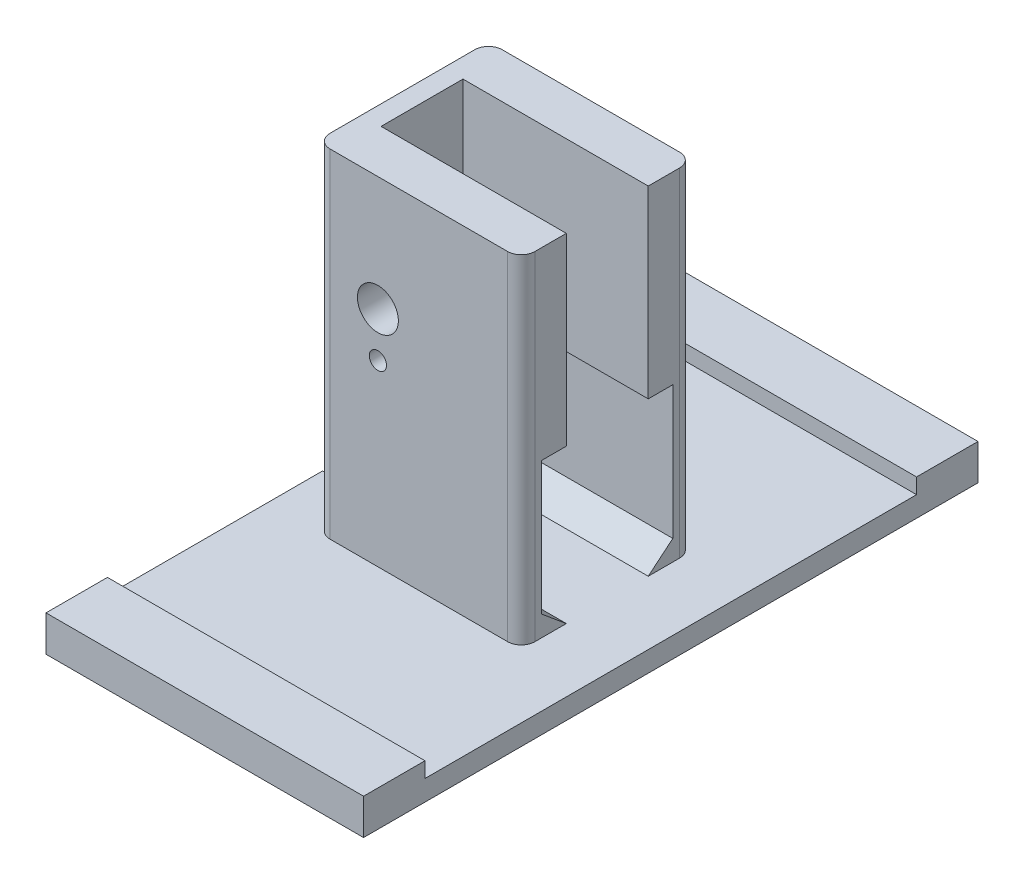
ISO-10303-21;
HEADER;
FILE_DESCRIPTION(('STEP AP214'),'2;1');
FILE_NAME('part.step','',(''),(''),'','','');
FILE_SCHEMA(('AUTOMOTIVE_DESIGN { 1 0 10303 214 1 1 1 1 }'));
ENDSEC;
DATA;
#1=APPLICATION_CONTEXT('core data for automotive mechanical design processes');
#2=APPLICATION_PROTOCOL_DEFINITION('international standard','automotive_design',2000,#1);
#3=PRODUCT_CONTEXT('',#1,'mechanical');
#4=PRODUCT('Part','Part','',(#3));
#5=PRODUCT_RELATED_PRODUCT_CATEGORY('part','',(#4));
#6=PRODUCT_DEFINITION_FORMATION('','',#4);
#7=PRODUCT_DEFINITION_CONTEXT('part definition',#1,'design');
#8=PRODUCT_DEFINITION('design','',#6,#7);
#9=PRODUCT_DEFINITION_SHAPE('','',#8);
#10=(LENGTH_UNIT() NAMED_UNIT(*) SI_UNIT(.MILLI.,.METRE.));
#11=(NAMED_UNIT(*) PLANE_ANGLE_UNIT() SI_UNIT($,.RADIAN.));
#12=(NAMED_UNIT(*) SI_UNIT($,.STERADIAN.) SOLID_ANGLE_UNIT());
#13=UNCERTAINTY_MEASURE_WITH_UNIT(LENGTH_MEASURE(1.E-05),#10,'distance_accuracy_value','');
#14=(GEOMETRIC_REPRESENTATION_CONTEXT(3) GLOBAL_UNCERTAINTY_ASSIGNED_CONTEXT((#13)) GLOBAL_UNIT_ASSIGNED_CONTEXT((#10,
#11,#12)) REPRESENTATION_CONTEXT('',''));
#15=CARTESIAN_POINT('',(0.,0.,0.));
#16=DIRECTION('',(0.,0.,1.));
#17=DIRECTION('',(1.,0.,0.));
#18=AXIS2_PLACEMENT_3D('',#15,#16,#17);
#19=CARTESIAN_POINT('',(0.,44.45,-43.18));
#20=DIRECTION('',(0.,0.,-1.));
#21=DIRECTION('',(-1.,0.,0.));
#22=AXIS2_PLACEMENT_3D('',#19,#20,#21);
#23=PLANE('',#22);
#24=CARTESIAN_POINT('',(13.7278569507453,24.6888,-43.18));
#25=DIRECTION('',(0.,0.,-1.));
#26=DIRECTION('',(-1.,0.,0.));
#27=AXIS2_PLACEMENT_3D('',#24,#25,#26);
#28=CIRCLE('',#27,1.0668);
#29=CARTESIAN_POINT('',(12.6610569507453,24.6888,-43.18));
#30=VERTEX_POINT('',#29);
#31=EDGE_CURVE('E324',#30,#30,#28,.T.);
#32=ORIENTED_EDGE('',*,*,#31,.T.);
#33=EDGE_LOOP('',(#32));
#34=FACE_BOUND('',#33,.T.);
#35=CARTESIAN_POINT('',(13.7278569507453,30.226,-43.18));
#36=DIRECTION('',(0.,0.,-1.));
#37=DIRECTION('',(-1.,0.,0.));
#38=AXIS2_PLACEMENT_3D('',#35,#36,#37);
#39=CIRCLE('',#38,2.54);
#40=CARTESIAN_POINT('',(11.1878569507453,30.226,-43.18));
#41=VERTEX_POINT('',#40);
#42=EDGE_CURVE('E336',#41,#41,#39,.T.);
#43=ORIENTED_EDGE('',*,*,#42,.T.);
#44=EDGE_LOOP('',(#43));
#45=FACE_BOUND('',#44,.T.);
#46=DIRECTION('',(1.,0.,0.));
#47=VECTOR('',#46,1.);
#48=CARTESIAN_POINT('',(31.5078569507453,21.59,-43.18));
#49=LINE('',#48,#47);
#50=CARTESIAN_POINT('',(8.53341445597468,21.59,-43.18));
#51=VERTEX_POINT('',#50);
#52=CARTESIAN_POINT('',(31.5078569507453,21.59,-43.18));
#53=VERTEX_POINT('',#52);
#54=EDGE_CURVE('E882',#51,#53,#49,.T.);
#55=ORIENTED_EDGE('',*,*,#54,.T.);
#56=DIRECTION('',(0.,-1.,0.));
#57=VECTOR('',#56,1.);
#58=CARTESIAN_POINT('',(31.5078569507453,44.45,-43.18));
#59=LINE('',#58,#57);
#60=CARTESIAN_POINT('',(31.5078569507453,44.45,-43.18));
#61=VERTEX_POINT('',#60);
#62=EDGE_CURVE('E364',#61,#53,#59,.T.);
#63=ORIENTED_EDGE('',*,*,#62,.F.);
#64=DIRECTION('',(1.,0.,0.));
#65=VECTOR('',#64,1.);
#66=CARTESIAN_POINT('',(0.,44.45,-43.18));
#67=LINE('',#66,#65);
#68=CARTESIAN_POINT('',(8.53341445597468,44.45,-43.18));
#69=VERTEX_POINT('',#68);
#70=EDGE_CURVE('E348',#69,#61,#67,.T.);
#71=ORIENTED_EDGE('',*,*,#70,.F.);
#72=DIRECTION('',(0.,-1.,0.));
#73=VECTOR('',#72,1.);
#74=CARTESIAN_POINT('',(8.53341445597468,44.45,-43.18));
#75=LINE('',#74,#73);
#76=EDGE_CURVE('E367',#69,#51,#75,.T.);
#77=ORIENTED_EDGE('',*,*,#76,.T.);
#78=EDGE_LOOP('',(#55,#63,#71,#77));
#79=FACE_BOUND('',#78,.T.);
#80=ADVANCED_FACE('F35',(#34,#45,#79),#23,.F.);
#81=CARTESIAN_POINT('',(31.5078569507453,44.45,0.));
#82=DIRECTION('',(1.,0.,0.));
#83=DIRECTION('',(0.,0.,-1.));
#84=AXIS2_PLACEMENT_3D('',#81,#82,#83);
#85=PLANE('',#84);
#86=DIRECTION('',(0.,0.64018439966448,-0.768221279597376));
#87=VECTOR('',#86,1.);
#88=CARTESIAN_POINT('',(31.5078569507453,2.54,-43.18));
#89=LINE('',#88,#87);
#90=CARTESIAN_POINT('',(31.5078569507453,2.54,-43.18));
#91=VERTEX_POINT('',#90);
#92=CARTESIAN_POINT('',(31.5078569507453,5.08,-46.228));
#93=VERTEX_POINT('',#92);
#94=EDGE_CURVE('E226',#91,#93,#89,.T.);
#95=ORIENTED_EDGE('',*,*,#94,.F.);
#96=DIRECTION('',(0.,0.,-1.));
#97=VECTOR('',#96,1.);
#98=CARTESIAN_POINT('',(31.5078569507453,2.54,0.));
#99=LINE('',#98,#97);
#100=CARTESIAN_POINT('',(31.5078569507453,2.54,-47.0746666666667));
#101=VERTEX_POINT('',#100);
#102=EDGE_CURVE('E231',#91,#101,#99,.T.);
#103=ORIENTED_EDGE('',*,*,#102,.T.);
#104=DIRECTION('',(0.,1.,0.));
#105=VECTOR('',#104,1.);
#106=CARTESIAN_POINT('',(31.5078569507453,0.145265034381545,-47.0746666666667));
#107=LINE('',#106,#105);
#108=CARTESIAN_POINT('',(31.5078569507453,44.45,-47.0746666666667));
#109=VERTEX_POINT('',#108);
#110=EDGE_CURVE('E306',#101,#109,#107,.T.);
#111=ORIENTED_EDGE('',*,*,#110,.T.);
#112=DIRECTION('',(0.,0.,1.));
#113=VECTOR('',#112,1.);
#114=CARTESIAN_POINT('',(31.5078569507453,44.45,0.));
#115=LINE('',#114,#113);
#116=EDGE_CURVE('E351',#109,#61,#115,.T.);
#117=ORIENTED_EDGE('',*,*,#116,.T.);
#118=ORIENTED_EDGE('',*,*,#62,.T.);
#119=DIRECTION('',(0.,0.,-1.));
#120=VECTOR('',#119,1.);
#121=CARTESIAN_POINT('',(31.5078569507453,21.59,-46.228));
#122=LINE('',#121,#120);
#123=CARTESIAN_POINT('',(31.5078569507453,21.59,-46.228));
#124=VERTEX_POINT('',#123);
#125=EDGE_CURVE('E885',#53,#124,#122,.T.);
#126=ORIENTED_EDGE('',*,*,#125,.T.);
#127=DIRECTION('',(0.,-1.,0.));
#128=VECTOR('',#127,1.);
#129=CARTESIAN_POINT('',(31.5078569507453,21.59,-46.228));
#130=LINE('',#129,#128);
#131=EDGE_CURVE('E240',#124,#93,#130,.T.);
#132=ORIENTED_EDGE('',*,*,#131,.T.);
#133=EDGE_LOOP('',(#95,#103,#111,#117,#118,#126,#132));
#134=FACE_BOUND('',#133,.T.);
#135=ADVANCED_FACE('F236',(#134),#85,.T.);
#136=CARTESIAN_POINT('',(0.,44.45,-27.432));
#137=DIRECTION('',(0.,0.,-1.));
#138=DIRECTION('',(-1.,0.,0.));
#139=AXIS2_PLACEMENT_3D('',#136,#137,#138);
#140=PLANE('',#139);
#141=CARTESIAN_POINT('',(13.7278569507453,30.226,-27.432));
#142=DIRECTION('',(0.,0.,-1.));
#143=DIRECTION('',(-1.,0.,0.));
#144=AXIS2_PLACEMENT_3D('',#141,#142,#143);
#145=CIRCLE('',#144,2.54);
#146=CARTESIAN_POINT('',(11.1878569507453,30.226,-27.432));
#147=VERTEX_POINT('',#146);
#148=EDGE_CURVE('E333',#147,#147,#145,.F.);
#149=ORIENTED_EDGE('',*,*,#148,.F.);
#150=EDGE_LOOP('',(#149));
#151=FACE_BOUND('',#150,.T.);
#152=CARTESIAN_POINT('',(13.7278569507453,24.6888,-27.432));
#153=DIRECTION('',(0.,0.,-1.));
#154=DIRECTION('',(-1.,0.,0.));
#155=AXIS2_PLACEMENT_3D('',#152,#153,#154);
#156=CIRCLE('',#155,1.0668);
#157=CARTESIAN_POINT('',(12.6610569507453,24.6888,-27.432));
#158=VERTEX_POINT('',#157);
#159=EDGE_CURVE('E321',#158,#158,#156,.F.);
#160=ORIENTED_EDGE('',*,*,#159,.F.);
#161=EDGE_LOOP('',(#160));
#162=FACE_BOUND('',#161,.T.);
#163=DIRECTION('',(0.,1.,0.));
#164=VECTOR('',#163,1.);
#165=CARTESIAN_POINT('',(29.8145236174119,0.145265034381545,-27.432));
#166=LINE('',#165,#164);
#167=CARTESIAN_POINT('',(29.8145236174119,2.54,-27.432));
#168=VERTEX_POINT('',#167);
#169=CARTESIAN_POINT('',(29.8145236174119,44.45,-27.432));
#170=VERTEX_POINT('',#169);
#171=EDGE_CURVE('E873',#168,#170,#166,.T.);
#172=ORIENTED_EDGE('',*,*,#171,.T.);
#173=DIRECTION('',(1.,0.,0.));
#174=VECTOR('',#173,1.);
#175=CARTESIAN_POINT('',(0.,44.45,-27.432));
#176=LINE('',#175,#174);
#177=CARTESIAN_POINT('',(7.80119028407861,44.45,-27.432));
#178=VERTEX_POINT('',#177);
#179=EDGE_CURVE('E358',#178,#170,#176,.T.);
#180=ORIENTED_EDGE('',*,*,#179,.F.);
#181=DIRECTION('',(0.,1.,0.));
#182=VECTOR('',#181,1.);
#183=CARTESIAN_POINT('',(7.80119028407861,0.145265034381545,-27.432));
#184=LINE('',#183,#182);
#185=CARTESIAN_POINT('',(7.80119028407861,2.54,-27.432));
#186=VERTEX_POINT('',#185);
#187=EDGE_CURVE('E302',#186,#178,#184,.T.);
#188=ORIENTED_EDGE('',*,*,#187,.F.);
#189=DIRECTION('',(-1.,0.,0.));
#190=VECTOR('',#189,1.);
#191=CARTESIAN_POINT('',(0.,2.54,-27.432));
#192=LINE('',#191,#190);
#193=EDGE_CURVE('E273',#168,#186,#192,.T.);
#194=ORIENTED_EDGE('',*,*,#193,.F.);
#195=EDGE_LOOP('',(#172,#180,#188,#194));
#196=FACE_BOUND('',#195,.T.);
#197=ADVANCED_FACE('F501',(#151,#162,#196),#140,.F.);
#198=DIRECTION('',(0.,-0.64018439966448,-0.768221279597376));
#199=VECTOR('',#198,1.);
#200=CARTESIAN_POINT('',(31.5078569507453,2.54,-33.02));
#201=LINE('',#200,#199);
#202=CARTESIAN_POINT('',(31.5078569507453,5.08,-29.972));
#203=VERTEX_POINT('',#202);
#204=CARTESIAN_POINT('',(31.5078569507453,2.54,-33.02));
#205=VERTEX_POINT('',#204);
#206=EDGE_CURVE('E262',#203,#205,#201,.T.);
#207=ORIENTED_EDGE('',*,*,#206,.F.);
#208=DIRECTION('',(0.,-1.,0.));
#209=VECTOR('',#208,1.);
#210=CARTESIAN_POINT('',(31.5078569507453,21.59,-29.972));
#211=LINE('',#210,#209);
#212=CARTESIAN_POINT('',(31.5078569507453,21.59,-29.972));
#213=VERTEX_POINT('',#212);
#214=EDGE_CURVE('E893',#213,#203,#211,.T.);
#215=ORIENTED_EDGE('',*,*,#214,.F.);
#216=DIRECTION('',(0.,0.,-1.));
#217=VECTOR('',#216,1.);
#218=CARTESIAN_POINT('',(31.5078569507453,21.59,-29.972));
#219=LINE('',#218,#217);
#220=CARTESIAN_POINT('',(31.5078569507453,21.59,-33.02));
#221=VERTEX_POINT('',#220);
#222=EDGE_CURVE('E853',#213,#221,#219,.T.);
#223=ORIENTED_EDGE('',*,*,#222,.T.);
#224=DIRECTION('',(0.,-1.,0.));
#225=VECTOR('',#224,1.);
#226=CARTESIAN_POINT('',(31.5078569507453,44.45,-33.02));
#227=LINE('',#226,#225);
#228=CARTESIAN_POINT('',(31.5078569507453,44.45,-33.02));
#229=VERTEX_POINT('',#228);
#230=EDGE_CURVE('E361',#229,#221,#227,.T.);
#231=ORIENTED_EDGE('',*,*,#230,.F.);
#232=CARTESIAN_POINT('',(31.5078569507453,44.45,-29.1253333333333));
#233=VERTEX_POINT('',#232);
#234=EDGE_CURVE('E354',#229,#233,#115,.T.);
#235=ORIENTED_EDGE('',*,*,#234,.T.);
#236=DIRECTION('',(0.,1.,0.));
#237=VECTOR('',#236,1.);
#238=CARTESIAN_POINT('',(31.5078569507453,0.145265034381545,-29.1253333333333));
#239=LINE('',#238,#237);
#240=CARTESIAN_POINT('',(31.5078569507453,2.54,-29.1253333333333));
#241=VERTEX_POINT('',#240);
#242=EDGE_CURVE('E272',#241,#233,#239,.T.);
#243=ORIENTED_EDGE('',*,*,#242,.F.);
#244=DIRECTION('',(0.,0.,-1.));
#245=VECTOR('',#244,1.);
#246=CARTESIAN_POINT('',(31.5078569507453,2.54,0.));
#247=LINE('',#246,#245);
#248=EDGE_CURVE('E258',#241,#205,#247,.T.);
#249=ORIENTED_EDGE('',*,*,#248,.T.);
#250=EDGE_LOOP('',(#207,#215,#223,#231,#235,#243,#249));
#251=FACE_BOUND('',#250,.T.);
#252=ADVANCED_FACE('F270',(#251),#85,.T.);
#253=CARTESIAN_POINT('',(0.,44.45,-48.768));
#254=DIRECTION('',(0.,0.,-1.));
#255=DIRECTION('',(-1.,0.,0.));
#256=AXIS2_PLACEMENT_3D('',#253,#254,#255);
#257=PLANE('',#256);
#258=CARTESIAN_POINT('',(13.7278569507453,24.6888,-48.768));
#259=DIRECTION('',(0.,0.,-1.));
#260=DIRECTION('',(-1.,0.,0.));
#261=AXIS2_PLACEMENT_3D('',#258,#259,#260);
#262=CIRCLE('',#261,1.0668);
#263=CARTESIAN_POINT('',(12.6610569507453,24.6888,-48.768));
#264=VERTEX_POINT('',#263);
#265=EDGE_CURVE('E312',#264,#264,#262,.T.);
#266=ORIENTED_EDGE('',*,*,#265,.F.);
#267=EDGE_LOOP('',(#266));
#268=FACE_BOUND('',#267,.T.);
#269=CARTESIAN_POINT('',(13.7278569507453,30.226,-48.768));
#270=DIRECTION('',(0.,0.,-1.));
#271=DIRECTION('',(-1.,0.,0.));
#272=AXIS2_PLACEMENT_3D('',#269,#270,#271);
#273=CIRCLE('',#272,2.54);
#274=CARTESIAN_POINT('',(11.1878569507453,30.226,-48.768));
#275=VERTEX_POINT('',#274);
#276=EDGE_CURVE('E330',#275,#275,#273,.T.);
#277=ORIENTED_EDGE('',*,*,#276,.F.);
#278=EDGE_LOOP('',(#277));
#279=FACE_BOUND('',#278,.T.);
#280=DIRECTION('',(1.,0.,0.));
#281=VECTOR('',#280,1.);
#282=CARTESIAN_POINT('',(0.,44.45,-48.768));
#283=LINE('',#282,#281);
#284=CARTESIAN_POINT('',(7.80119028407861,44.45,-48.768));
#285=VERTEX_POINT('',#284);
#286=CARTESIAN_POINT('',(29.8145236174119,44.45,-48.768));
#287=VERTEX_POINT('',#286);
#288=EDGE_CURVE('E353',#285,#287,#283,.T.);
#289=ORIENTED_EDGE('',*,*,#288,.T.);
#290=DIRECTION('',(0.,1.,0.));
#291=VECTOR('',#290,1.);
#292=CARTESIAN_POINT('',(29.8145236174119,0.145265034381545,-48.768));
#293=LINE('',#292,#291);
#294=CARTESIAN_POINT('',(29.8145236174119,2.54,-48.768));
#295=VERTEX_POINT('',#294);
#296=EDGE_CURVE('E300',#295,#287,#293,.T.);
#297=ORIENTED_EDGE('',*,*,#296,.F.);
#298=DIRECTION('',(-1.,0.,0.));
#299=VECTOR('',#298,1.);
#300=CARTESIAN_POINT('',(0.,2.54,-48.768));
#301=LINE('',#300,#299);
#302=CARTESIAN_POINT('',(7.80119028407861,2.54,-48.768));
#303=VERTEX_POINT('',#302);
#304=EDGE_CURVE('E245',#295,#303,#301,.T.);
#305=ORIENTED_EDGE('',*,*,#304,.T.);
#306=DIRECTION('',(0.,1.,0.));
#307=VECTOR('',#306,1.);
#308=CARTESIAN_POINT('',(7.80119028407861,0.145265034381545,-48.768));
#309=LINE('',#308,#307);
#310=EDGE_CURVE('E315',#303,#285,#309,.T.);
#311=ORIENTED_EDGE('',*,*,#310,.T.);
#312=EDGE_LOOP('',(#289,#297,#305,#311));
#313=FACE_BOUND('',#312,.T.);
#314=ADVANCED_FACE('F506',(#268,#279,#313),#257,.T.);
#315=CARTESIAN_POINT('',(0.,44.45,0.));
#316=DIRECTION('',(0.,1.,0.));
#317=DIRECTION('',(0.,0.,1.));
#318=AXIS2_PLACEMENT_3D('',#315,#316,#317);
#319=PLANE('',#318);
#320=CARTESIAN_POINT('',(29.8145236174119,44.45,-29.1253333333333));
#321=DIRECTION('',(0.,1.,0.));
#322=DIRECTION('',(0.,0.,1.));
#323=AXIS2_PLACEMENT_3D('',#320,#321,#322);
#324=CIRCLE('',#323,1.69333333333334);
#325=EDGE_CURVE('E845',#233,#170,#324,.F.);
#326=ORIENTED_EDGE('',*,*,#325,.F.);
#327=ORIENTED_EDGE('',*,*,#234,.F.);
#328=DIRECTION('',(1.,0.,0.));
#329=VECTOR('',#328,1.);
#330=CARTESIAN_POINT('',(0.,44.45,-33.02));
#331=LINE('',#330,#329);
#332=CARTESIAN_POINT('',(8.53341445597468,44.45,-33.02));
#333=VERTEX_POINT('',#332);
#334=EDGE_CURVE('E342',#333,#229,#331,.T.);
#335=ORIENTED_EDGE('',*,*,#334,.F.);
#336=DIRECTION('',(0.,0.,1.));
#337=VECTOR('',#336,1.);
#338=CARTESIAN_POINT('',(8.53341445597469,44.45,0.));
#339=LINE('',#338,#337);
#340=EDGE_CURVE('E345',#69,#333,#339,.T.);
#341=ORIENTED_EDGE('',*,*,#340,.F.);
#342=ORIENTED_EDGE('',*,*,#70,.T.);
#343=ORIENTED_EDGE('',*,*,#116,.F.);
#344=CARTESIAN_POINT('',(29.8145236174119,44.45,-47.0746666666667));
#345=DIRECTION('',(0.,1.,0.));
#346=DIRECTION('',(0.,0.,1.));
#347=AXIS2_PLACEMENT_3D('',#344,#345,#346);
#348=CIRCLE('',#347,1.69333333333334);
#349=EDGE_CURVE('E298',#287,#109,#348,.F.);
#350=ORIENTED_EDGE('',*,*,#349,.F.);
#351=ORIENTED_EDGE('',*,*,#288,.F.);
#352=CARTESIAN_POINT('',(7.80119028407861,44.45,-47.0746666666667));
#353=DIRECTION('',(0.,1.,0.));
#354=DIRECTION('',(0.,0.,1.));
#355=AXIS2_PLACEMENT_3D('',#352,#353,#354);
#356=CIRCLE('',#355,1.69333333333334);
#357=CARTESIAN_POINT('',(6.10785695074527,44.45,-47.0746666666667));
#358=VERTEX_POINT('',#357);
#359=EDGE_CURVE('E310',#285,#358,#356,.T.);
#360=ORIENTED_EDGE('',*,*,#359,.T.);
#361=DIRECTION('',(0.,0.,-1.));
#362=VECTOR('',#361,1.);
#363=CARTESIAN_POINT('',(6.10785695074527,44.45,0.));
#364=LINE('',#363,#362);
#365=CARTESIAN_POINT('',(6.10785695074527,44.45,-29.1253333333333));
#366=VERTEX_POINT('',#365);
#367=EDGE_CURVE('E58',#366,#358,#364,.T.);
#368=ORIENTED_EDGE('',*,*,#367,.F.);
#369=CARTESIAN_POINT('',(7.80119028407861,44.45,-29.1253333333333));
#370=DIRECTION('',(0.,1.,0.));
#371=DIRECTION('',(0.,0.,1.));
#372=AXIS2_PLACEMENT_3D('',#369,#370,#371);
#373=CIRCLE('',#372,1.69333333333334);
#374=EDGE_CURVE('E869',#178,#366,#373,.F.);
#375=ORIENTED_EDGE('',*,*,#374,.F.);
#376=ORIENTED_EDGE('',*,*,#179,.T.);
#377=EDGE_LOOP('',(#326,#327,#335,#341,#342,#343,#350,#351,#360,#368,#375,#376));
#378=FACE_BOUND('',#377,.T.);
#379=ADVANCED_FACE('F744',(#378),#319,.T.);
#380=CARTESIAN_POINT('',(39.3827,4.445,0.));
#381=DIRECTION('',(-1.,0.,0.));
#382=DIRECTION('',(0.,0.,1.));
#383=AXIS2_PLACEMENT_3D('',#380,#381,#382);
#384=PLANE('',#383);
#385=DIRECTION('',(0.,0.,-1.));
#386=VECTOR('',#385,1.);
#387=CARTESIAN_POINT('',(39.3827,0.,0.));
#388=LINE('',#387,#386);
#389=CARTESIAN_POINT('',(39.3827,0.,0.));
#390=VERTEX_POINT('',#389);
#391=CARTESIAN_POINT('',(39.3827,0.,-76.2));
#392=VERTEX_POINT('',#391);
#393=EDGE_CURVE('E427',#390,#392,#388,.T.);
#394=ORIENTED_EDGE('',*,*,#393,.T.);
#395=DIRECTION('',(0.,-1.,0.));
#396=VECTOR('',#395,1.);
#397=CARTESIAN_POINT('',(39.3827,4.445,-76.2));
#398=LINE('',#397,#396);
#399=CARTESIAN_POINT('',(39.3827,4.445,-76.2));
#400=VERTEX_POINT('',#399);
#401=EDGE_CURVE('E930',#400,#392,#398,.T.);
#402=ORIENTED_EDGE('',*,*,#401,.F.);
#403=DIRECTION('',(0.,0.,-1.));
#404=VECTOR('',#403,1.);
#405=CARTESIAN_POINT('',(39.3827,4.445,0.));
#406=LINE('',#405,#404);
#407=CARTESIAN_POINT('',(39.3827,4.445,-68.58));
#408=VERTEX_POINT('',#407);
#409=EDGE_CURVE('E377',#408,#400,#406,.T.);
#410=ORIENTED_EDGE('',*,*,#409,.F.);
#411=DIRECTION('',(0.,-1.,0.));
#412=VECTOR('',#411,1.);
#413=CARTESIAN_POINT('',(39.3827,4.445,-68.58));
#414=LINE('',#413,#412);
#415=CARTESIAN_POINT('',(39.3827,2.54,-68.58));
#416=VERTEX_POINT('',#415);
#417=EDGE_CURVE('E394',#408,#416,#414,.T.);
#418=ORIENTED_EDGE('',*,*,#417,.T.);
#419=DIRECTION('',(0.,0.,-1.));
#420=VECTOR('',#419,1.);
#421=CARTESIAN_POINT('',(39.3827,2.54,0.));
#422=LINE('',#421,#420);
#423=CARTESIAN_POINT('',(39.3827,2.54,-7.62));
#424=VERTEX_POINT('',#423);
#425=EDGE_CURVE('E407',#424,#416,#422,.T.);
#426=ORIENTED_EDGE('',*,*,#425,.F.);
#427=DIRECTION('',(0.,-1.,0.));
#428=VECTOR('',#427,1.);
#429=CARTESIAN_POINT('',(39.3827,4.445,-7.62));
#430=LINE('',#429,#428);
#431=CARTESIAN_POINT('',(39.3827,4.445,-7.62));
#432=VERTEX_POINT('',#431);
#433=EDGE_CURVE('E274',#432,#424,#430,.T.);
#434=ORIENTED_EDGE('',*,*,#433,.F.);
#435=DIRECTION('',(0.,0.,-1.));
#436=VECTOR('',#435,1.);
#437=CARTESIAN_POINT('',(39.3827,4.445,0.));
#438=LINE('',#437,#436);
#439=CARTESIAN_POINT('',(39.3827,4.445,0.));
#440=VERTEX_POINT('',#439);
#441=EDGE_CURVE('E428',#440,#432,#438,.T.);
#442=ORIENTED_EDGE('',*,*,#441,.F.);
#443=DIRECTION('',(0.,-1.,0.));
#444=VECTOR('',#443,1.);
#445=CARTESIAN_POINT('',(39.3827,4.445,0.));
#446=LINE('',#445,#444);
#447=EDGE_CURVE('E439',#440,#390,#446,.T.);
#448=ORIENTED_EDGE('',*,*,#447,.T.);
#449=EDGE_LOOP('',(#394,#402,#410,#418,#426,#434,#442,#448));
#450=FACE_BOUND('',#449,.T.);
#451=ADVANCED_FACE('F37',(#450),#384,.F.);
#452=CARTESIAN_POINT('',(0.,4.445,-7.62));
#453=DIRECTION('',(0.,0.,1.));
#454=DIRECTION('',(1.,0.,0.));
#455=AXIS2_PLACEMENT_3D('',#452,#453,#454);
#456=PLANE('',#455);
#457=ORIENTED_EDGE('',*,*,#433,.T.);
#458=DIRECTION('',(-1.,0.,0.));
#459=VECTOR('',#458,1.);
#460=CARTESIAN_POINT('',(0.,2.54,-7.62));
#461=LINE('',#460,#459);
#462=CARTESIAN_POINT('',(0.,2.54,-7.62));
#463=VERTEX_POINT('',#462);
#464=EDGE_CURVE('E406',#424,#463,#461,.T.);
#465=ORIENTED_EDGE('',*,*,#464,.T.);
#466=DIRECTION('',(0.,-1.,0.));
#467=VECTOR('',#466,1.);
#468=CARTESIAN_POINT('',(0.,4.445,-7.62));
#469=LINE('',#468,#467);
#470=CARTESIAN_POINT('',(0.,4.445,-7.62));
#471=VERTEX_POINT('',#470);
#472=EDGE_CURVE('E278',#471,#463,#469,.T.);
#473=ORIENTED_EDGE('',*,*,#472,.F.);
#474=DIRECTION('',(-1.,0.,0.));
#475=VECTOR('',#474,1.);
#476=CARTESIAN_POINT('',(0.,4.445,-7.62));
#477=LINE('',#476,#475);
#478=EDGE_CURVE('E431',#432,#471,#477,.T.);
#479=ORIENTED_EDGE('',*,*,#478,.F.);
#480=EDGE_LOOP('',(#457,#465,#473,#479));
#481=FACE_BOUND('',#480,.T.);
#482=ADVANCED_FACE('F460',(#481),#456,.F.);
#483=CARTESIAN_POINT('',(0.,4.445,0.));
#484=DIRECTION('',(-1.,0.,0.));
#485=DIRECTION('',(0.,0.,1.));
#486=AXIS2_PLACEMENT_3D('',#483,#484,#485);
#487=PLANE('',#486);
#488=DIRECTION('',(0.,0.,-1.));
#489=VECTOR('',#488,1.);
#490=CARTESIAN_POINT('',(0.,0.,0.));
#491=LINE('',#490,#489);
#492=CARTESIAN_POINT('',(0.,0.,0.));
#493=VERTEX_POINT('',#492);
#494=CARTESIAN_POINT('',(0.,0.,-34.29));
#495=VERTEX_POINT('',#494);
#496=EDGE_CURVE('E441',#493,#495,#491,.T.);
#497=ORIENTED_EDGE('',*,*,#496,.F.);
#498=DIRECTION('',(0.,-1.,0.));
#499=VECTOR('',#498,1.);
#500=CARTESIAN_POINT('',(0.,4.445,0.));
#501=LINE('',#500,#499);
#502=CARTESIAN_POINT('',(0.,4.445,0.));
#503=VERTEX_POINT('',#502);
#504=EDGE_CURVE('E446',#503,#493,#501,.T.);
#505=ORIENTED_EDGE('',*,*,#504,.F.);
#506=DIRECTION('',(0.,0.,-1.));
#507=VECTOR('',#506,1.);
#508=CARTESIAN_POINT('',(0.,4.445,0.));
#509=LINE('',#508,#507);
#510=EDGE_CURVE('E434',#503,#471,#509,.T.);
#511=ORIENTED_EDGE('',*,*,#510,.T.);
#512=ORIENTED_EDGE('',*,*,#472,.T.);
#513=DIRECTION('',(0.,0.,-1.));
#514=VECTOR('',#513,1.);
#515=CARTESIAN_POINT('',(0.,2.54,0.));
#516=LINE('',#515,#514);
#517=CARTESIAN_POINT('',(0.,2.54,-34.29));
#518=VERTEX_POINT('',#517);
#519=EDGE_CURVE('E402',#463,#518,#516,.T.);
#520=ORIENTED_EDGE('',*,*,#519,.T.);
#521=DIRECTION('',(0.,-1.,0.));
#522=VECTOR('',#521,1.);
#523=CARTESIAN_POINT('',(0.,2.54,-34.29));
#524=LINE('',#523,#522);
#525=EDGE_CURVE('E414',#518,#495,#524,.T.);
#526=ORIENTED_EDGE('',*,*,#525,.T.);
#527=EDGE_LOOP('',(#497,#505,#511,#512,#520,#526));
#528=FACE_BOUND('',#527,.T.);
#529=ADVANCED_FACE('F456',(#528),#487,.T.);
#530=CARTESIAN_POINT('',(0.,4.445,0.));
#531=DIRECTION('',(0.,0.,-1.));
#532=DIRECTION('',(-1.,0.,0.));
#533=AXIS2_PLACEMENT_3D('',#530,#531,#532);
#534=PLANE('',#533);
#535=DIRECTION('',(1.,0.,0.));
#536=VECTOR('',#535,1.);
#537=CARTESIAN_POINT('',(0.,0.,0.));
#538=LINE('',#537,#536);
#539=EDGE_CURVE('E432',#493,#390,#538,.T.);
#540=ORIENTED_EDGE('',*,*,#539,.T.);
#541=ORIENTED_EDGE('',*,*,#447,.F.);
#542=DIRECTION('',(1.,0.,0.));
#543=VECTOR('',#542,1.);
#544=CARTESIAN_POINT('',(0.,4.445,0.));
#545=LINE('',#544,#543);
#546=EDGE_CURVE('E437',#503,#440,#545,.T.);
#547=ORIENTED_EDGE('',*,*,#546,.F.);
#548=ORIENTED_EDGE('',*,*,#504,.T.);
#549=EDGE_LOOP('',(#540,#541,#547,#548));
#550=FACE_BOUND('',#549,.T.);
#551=ADVANCED_FACE('F478',(#550),#534,.F.);
#552=CARTESIAN_POINT('',(0.,4.445,0.));
#553=DIRECTION('',(0.,1.,0.));
#554=DIRECTION('',(0.,0.,1.));
#555=AXIS2_PLACEMENT_3D('',#552,#553,#554);
#556=PLANE('',#555);
#557=ORIENTED_EDGE('',*,*,#441,.T.);
#558=ORIENTED_EDGE('',*,*,#478,.T.);
#559=ORIENTED_EDGE('',*,*,#510,.F.);
#560=ORIENTED_EDGE('',*,*,#546,.T.);
#561=EDGE_LOOP('',(#557,#558,#559,#560));
#562=FACE_BOUND('',#561,.T.);
#563=ADVANCED_FACE('F484',(#562),#556,.T.);
#564=CARTESIAN_POINT('',(0.,0.,0.));
#565=DIRECTION('',(0.,1.,0.));
#566=DIRECTION('',(0.,0.,1.));
#567=AXIS2_PLACEMENT_3D('',#564,#565,#566);
#568=PLANE('',#567);
#569=ORIENTED_EDGE('',*,*,#393,.F.);
#570=ORIENTED_EDGE('',*,*,#539,.F.);
#571=ORIENTED_EDGE('',*,*,#496,.T.);
#572=CARTESIAN_POINT('',(0.,0.,-38.1));
#573=DIRECTION('',(0.,1.,0.));
#574=DIRECTION('',(0.,0.,1.));
#575=AXIS2_PLACEMENT_3D('',#572,#573,#574);
#576=CIRCLE('',#575,3.81);
#577=CARTESIAN_POINT('',(0.,0.,-41.91));
#578=VERTEX_POINT('',#577);
#579=EDGE_CURVE('E420',#578,#495,#576,.F.);
#580=ORIENTED_EDGE('',*,*,#579,.F.);
#581=DIRECTION('',(0.,0.,-1.));
#582=VECTOR('',#581,1.);
#583=CARTESIAN_POINT('',(0.,0.,0.));
#584=LINE('',#583,#582);
#585=CARTESIAN_POINT('',(0.,0.,-76.2));
#586=VERTEX_POINT('',#585);
#587=EDGE_CURVE('E418',#578,#586,#584,.T.);
#588=ORIENTED_EDGE('',*,*,#587,.T.);
#589=DIRECTION('',(1.,0.,0.));
#590=VECTOR('',#589,1.);
#591=CARTESIAN_POINT('',(0.,0.,-76.2));
#592=LINE('',#591,#590);
#593=EDGE_CURVE('E373',#586,#392,#592,.T.);
#594=ORIENTED_EDGE('',*,*,#593,.T.);
#595=EDGE_LOOP('',(#569,#570,#571,#580,#588,#594));
#596=FACE_BOUND('',#595,.T.);
#597=ADVANCED_FACE('F474',(#596),#568,.F.);
#598=CARTESIAN_POINT('',(0.,2.54,0.));
#599=DIRECTION('',(-1.,0.,0.));
#600=DIRECTION('',(0.,0.,1.));
#601=AXIS2_PLACEMENT_3D('',#598,#599,#600);
#602=PLANE('',#601);
#603=ORIENTED_EDGE('',*,*,#587,.F.);
#604=DIRECTION('',(0.,-1.,0.));
#605=VECTOR('',#604,1.);
#606=CARTESIAN_POINT('',(0.,2.54,-41.91));
#607=LINE('',#606,#605);
#608=CARTESIAN_POINT('',(0.,2.54,-41.91));
#609=VERTEX_POINT('',#608);
#610=EDGE_CURVE('E425',#609,#578,#607,.T.);
#611=ORIENTED_EDGE('',*,*,#610,.F.);
#612=CARTESIAN_POINT('',(0.,2.54,-68.58));
#613=VERTEX_POINT('',#612);
#614=EDGE_CURVE('E281',#609,#613,#516,.T.);
#615=ORIENTED_EDGE('',*,*,#614,.T.);
#616=DIRECTION('',(0.,-1.,0.));
#617=VECTOR('',#616,1.);
#618=CARTESIAN_POINT('',(0.,4.445,-68.58));
#619=LINE('',#618,#617);
#620=CARTESIAN_POINT('',(0.,4.445,-68.58));
#621=VERTEX_POINT('',#620);
#622=EDGE_CURVE('E385',#621,#613,#619,.T.);
#623=ORIENTED_EDGE('',*,*,#622,.F.);
#624=DIRECTION('',(0.,0.,-1.));
#625=VECTOR('',#624,1.);
#626=CARTESIAN_POINT('',(0.,4.445,0.));
#627=LINE('',#626,#625);
#628=CARTESIAN_POINT('',(0.,4.445,-76.2));
#629=VERTEX_POINT('',#628);
#630=EDGE_CURVE('E382',#621,#629,#627,.T.);
#631=ORIENTED_EDGE('',*,*,#630,.T.);
#632=DIRECTION('',(0.,-1.,0.));
#633=VECTOR('',#632,1.);
#634=CARTESIAN_POINT('',(0.,4.445,-76.2));
#635=LINE('',#634,#633);
#636=EDGE_CURVE('E390',#629,#586,#635,.T.);
#637=ORIENTED_EDGE('',*,*,#636,.T.);
#638=EDGE_LOOP('',(#603,#611,#615,#623,#631,#637));
#639=FACE_BOUND('',#638,.T.);
#640=ADVANCED_FACE('F491',(#639),#602,.T.);
#641=CARTESIAN_POINT('',(0.,2.54,-38.1));
#642=DIRECTION('',(0.,-1.,0.));
#643=DIRECTION('',(0.,0.,-1.));
#644=AXIS2_PLACEMENT_3D('',#641,#642,#643);
#645=CYLINDRICAL_SURFACE('',#644,3.81);
#646=ORIENTED_EDGE('',*,*,#579,.T.);
#647=ORIENTED_EDGE('',*,*,#525,.F.);
#648=CARTESIAN_POINT('',(0.,2.54,-38.1));
#649=DIRECTION('',(0.,1.,0.));
#650=DIRECTION('',(0.,0.,1.));
#651=AXIS2_PLACEMENT_3D('',#648,#649,#650);
#652=CIRCLE('',#651,3.81);
#653=EDGE_CURVE('E398',#609,#518,#652,.F.);
#654=ORIENTED_EDGE('',*,*,#653,.F.);
#655=ORIENTED_EDGE('',*,*,#610,.T.);
#656=EDGE_LOOP('',(#646,#647,#654,#655));
#657=FACE_BOUND('',#656,.T.);
#658=ADVANCED_FACE('F468',(#657),#645,.F.);
#659=CARTESIAN_POINT('',(0.,2.54,0.));
#660=DIRECTION('',(0.,1.,0.));
#661=DIRECTION('',(0.,0.,1.));
#662=AXIS2_PLACEMENT_3D('',#659,#660,#661);
#663=PLANE('',#662);
#664=CARTESIAN_POINT('',(29.8145236174119,2.54,-29.1253333333333));
#665=DIRECTION('',(0.,1.,0.));
#666=DIRECTION('',(0.,0.,1.));
#667=AXIS2_PLACEMENT_3D('',#664,#665,#666);
#668=CIRCLE('',#667,1.69333333333334);
#669=EDGE_CURVE('E870',#168,#241,#668,.T.);
#670=ORIENTED_EDGE('',*,*,#669,.F.);
#671=ORIENTED_EDGE('',*,*,#193,.T.);
#672=CARTESIAN_POINT('',(7.80119028407861,2.54,-29.1253333333333));
#673=DIRECTION('',(0.,1.,0.));
#674=DIRECTION('',(0.,0.,1.));
#675=AXIS2_PLACEMENT_3D('',#672,#673,#674);
#676=CIRCLE('',#675,1.69333333333334);
#677=CARTESIAN_POINT('',(6.10785695074527,2.54,-29.1253333333333));
#678=VERTEX_POINT('',#677);
#679=EDGE_CURVE('E294',#678,#186,#676,.T.);
#680=ORIENTED_EDGE('',*,*,#679,.F.);
#681=DIRECTION('',(0.,0.,1.));
#682=VECTOR('',#681,1.);
#683=CARTESIAN_POINT('',(6.10785695074527,2.54,0.));
#684=LINE('',#683,#682);
#685=CARTESIAN_POINT('',(6.10785695074527,2.54,-47.0746666666667));
#686=VERTEX_POINT('',#685);
#687=EDGE_CURVE('E247',#686,#678,#684,.T.);
#688=ORIENTED_EDGE('',*,*,#687,.F.);
#689=CARTESIAN_POINT('',(7.80119028407861,2.54,-47.0746666666667));
#690=DIRECTION('',(0.,1.,0.));
#691=DIRECTION('',(0.,0.,1.));
#692=AXIS2_PLACEMENT_3D('',#689,#690,#691);
#693=CIRCLE('',#692,1.69333333333334);
#694=EDGE_CURVE('E291',#686,#303,#693,.F.);
#695=ORIENTED_EDGE('',*,*,#694,.T.);
#696=ORIENTED_EDGE('',*,*,#304,.F.);
#697=CARTESIAN_POINT('',(29.8145236174119,2.54,-47.0746666666667));
#698=DIRECTION('',(0.,1.,0.));
#699=DIRECTION('',(0.,0.,1.));
#700=AXIS2_PLACEMENT_3D('',#697,#698,#699);
#701=CIRCLE('',#700,1.69333333333334);
#702=EDGE_CURVE('E50',#101,#295,#701,.T.);
#703=ORIENTED_EDGE('',*,*,#702,.F.);
#704=ORIENTED_EDGE('',*,*,#102,.F.);
#705=DIRECTION('',(-1.,0.,0.));
#706=VECTOR('',#705,1.);
#707=CARTESIAN_POINT('',(0.,2.54,-43.18));
#708=LINE('',#707,#706);
#709=CARTESIAN_POINT('',(8.53341445597467,2.54,-43.18));
#710=VERTEX_POINT('',#709);
#711=EDGE_CURVE('E222',#91,#710,#708,.T.);
#712=ORIENTED_EDGE('',*,*,#711,.T.);
#713=DIRECTION('',(0.,0.,-1.));
#714=VECTOR('',#713,1.);
#715=CARTESIAN_POINT('',(8.53341445597469,2.54,0.));
#716=LINE('',#715,#714);
#717=CARTESIAN_POINT('',(8.53341445597468,2.53999999999999,-33.02));
#718=VERTEX_POINT('',#717);
#719=EDGE_CURVE('E43',#718,#710,#716,.T.);
#720=ORIENTED_EDGE('',*,*,#719,.F.);
#721=DIRECTION('',(-1.,0.,0.));
#722=VECTOR('',#721,1.);
#723=CARTESIAN_POINT('',(0.,2.54,-33.02));
#724=LINE('',#723,#722);
#725=EDGE_CURVE('E11',#205,#718,#724,.T.);
#726=ORIENTED_EDGE('',*,*,#725,.F.);
#727=ORIENTED_EDGE('',*,*,#248,.F.);
#728=EDGE_LOOP('',(#670,#671,#680,#688,#695,#696,#703,#704,#712,#720,#726,#727));
#729=FACE_BOUND('',#728,.T.);
#730=ORIENTED_EDGE('',*,*,#614,.F.);
#731=ORIENTED_EDGE('',*,*,#653,.T.);
#732=ORIENTED_EDGE('',*,*,#519,.F.);
#733=ORIENTED_EDGE('',*,*,#464,.F.);
#734=ORIENTED_EDGE('',*,*,#425,.T.);
#735=DIRECTION('',(-1.,0.,0.));
#736=VECTOR('',#735,1.);
#737=CARTESIAN_POINT('',(0.,2.54,-68.58));
#738=LINE('',#737,#736);
#739=EDGE_CURVE('E410',#416,#613,#738,.T.);
#740=ORIENTED_EDGE('',*,*,#739,.T.);
#741=EDGE_LOOP('',(#730,#731,#732,#733,#734,#740));
#742=FACE_BOUND('',#741,.T.);
#743=ADVANCED_FACE('F243',(#729,#742),#663,.T.);
#744=CARTESIAN_POINT('',(0.,4.445,-68.58));
#745=DIRECTION('',(0.,0.,1.));
#746=DIRECTION('',(1.,0.,0.));
#747=AXIS2_PLACEMENT_3D('',#744,#745,#746);
#748=PLANE('',#747);
#749=ORIENTED_EDGE('',*,*,#739,.F.);
#750=ORIENTED_EDGE('',*,*,#417,.F.);
#751=DIRECTION('',(-1.,0.,0.));
#752=VECTOR('',#751,1.);
#753=CARTESIAN_POINT('',(0.,4.445,-68.58));
#754=LINE('',#753,#752);
#755=EDGE_CURVE('E374',#408,#621,#754,.T.);
#756=ORIENTED_EDGE('',*,*,#755,.T.);
#757=ORIENTED_EDGE('',*,*,#622,.T.);
#758=EDGE_LOOP('',(#749,#750,#756,#757));
#759=FACE_BOUND('',#758,.T.);
#760=ADVANCED_FACE('F521',(#759),#748,.T.);
#761=CARTESIAN_POINT('',(0.,4.445,-76.2));
#762=DIRECTION('',(0.,0.,-1.));
#763=DIRECTION('',(-1.,0.,0.));
#764=AXIS2_PLACEMENT_3D('',#761,#762,#763);
#765=PLANE('',#764);
#766=ORIENTED_EDGE('',*,*,#593,.F.);
#767=ORIENTED_EDGE('',*,*,#636,.F.);
#768=DIRECTION('',(1.,0.,0.));
#769=VECTOR('',#768,1.);
#770=CARTESIAN_POINT('',(0.,4.445,-76.2));
#771=LINE('',#770,#769);
#772=EDGE_CURVE('E379',#629,#400,#771,.T.);
#773=ORIENTED_EDGE('',*,*,#772,.T.);
#774=ORIENTED_EDGE('',*,*,#401,.T.);
#775=EDGE_LOOP('',(#766,#767,#773,#774));
#776=FACE_BOUND('',#775,.T.);
#777=ADVANCED_FACE('F517',(#776),#765,.T.);
#778=CARTESIAN_POINT('',(0.,4.445,0.));
#779=DIRECTION('',(0.,1.,0.));
#780=DIRECTION('',(0.,0.,1.));
#781=AXIS2_PLACEMENT_3D('',#778,#779,#780);
#782=PLANE('',#781);
#783=ORIENTED_EDGE('',*,*,#755,.F.);
#784=ORIENTED_EDGE('',*,*,#409,.T.);
#785=ORIENTED_EDGE('',*,*,#772,.F.);
#786=ORIENTED_EDGE('',*,*,#630,.F.);
#787=EDGE_LOOP('',(#783,#784,#785,#786));
#788=FACE_BOUND('',#787,.T.);
#789=ADVANCED_FACE('F513',(#788),#782,.T.);
#790=CARTESIAN_POINT('',(0.,44.45,-33.02));
#791=DIRECTION('',(0.,0.,-1.));
#792=DIRECTION('',(-1.,0.,0.));
#793=AXIS2_PLACEMENT_3D('',#790,#791,#792);
#794=PLANE('',#793);
#795=DIRECTION('',(-1.,0.,0.));
#796=VECTOR('',#795,1.);
#797=CARTESIAN_POINT('',(31.5078569507453,21.59,-33.02));
#798=LINE('',#797,#796);
#799=CARTESIAN_POINT('',(8.53341445597468,21.59,-33.02));
#800=VERTEX_POINT('',#799);
#801=EDGE_CURVE('E900',#221,#800,#798,.T.);
#802=ORIENTED_EDGE('',*,*,#801,.T.);
#803=DIRECTION('',(0.,-1.,0.));
#804=VECTOR('',#803,1.);
#805=CARTESIAN_POINT('',(8.53341445597468,44.45,-33.02));
#806=LINE('',#805,#804);
#807=EDGE_CURVE('E370',#333,#800,#806,.T.);
#808=ORIENTED_EDGE('',*,*,#807,.F.);
#809=ORIENTED_EDGE('',*,*,#334,.T.);
#810=ORIENTED_EDGE('',*,*,#230,.T.);
#811=EDGE_LOOP('',(#802,#808,#809,#810));
#812=FACE_BOUND('',#811,.T.);
#813=CARTESIAN_POINT('',(13.7278569507453,24.6888,-33.02));
#814=DIRECTION('',(0.,0.,-1.));
#815=DIRECTION('',(-1.,0.,0.));
#816=AXIS2_PLACEMENT_3D('',#813,#814,#815);
#817=CIRCLE('',#816,1.0668);
#818=CARTESIAN_POINT('',(12.6610569507453,24.6888,-33.02));
#819=VERTEX_POINT('',#818);
#820=EDGE_CURVE('E327',#819,#819,#817,.T.);
#821=ORIENTED_EDGE('',*,*,#820,.F.);
#822=EDGE_LOOP('',(#821));
#823=FACE_BOUND('',#822,.T.);
#824=CARTESIAN_POINT('',(13.7278569507453,30.226,-33.02));
#825=DIRECTION('',(0.,0.,-1.));
#826=DIRECTION('',(-1.,0.,0.));
#827=AXIS2_PLACEMENT_3D('',#824,#825,#826);
#828=CIRCLE('',#827,2.54);
#829=CARTESIAN_POINT('',(11.1878569507453,30.226,-33.02));
#830=VERTEX_POINT('',#829);
#831=EDGE_CURVE('E339',#830,#830,#828,.T.);
#832=ORIENTED_EDGE('',*,*,#831,.F.);
#833=EDGE_LOOP('',(#832));
#834=FACE_BOUND('',#833,.T.);
#835=ADVANCED_FACE('F510',(#812,#823,#834),#794,.T.);
#836=CARTESIAN_POINT('',(8.53341445597469,44.45,0.));
#837=DIRECTION('',(1.,0.,0.));
#838=DIRECTION('',(0.,0.,-1.));
#839=AXIS2_PLACEMENT_3D('',#836,#837,#838);
#840=PLANE('',#839);
#841=ORIENTED_EDGE('',*,*,#719,.T.);
#842=DIRECTION('',(0.,-0.64018439966448,0.768221279597376));
#843=VECTOR('',#842,1.);
#844=CARTESIAN_POINT('',(8.53341445597467,2.54,-43.18));
#845=LINE('',#844,#843);
#846=CARTESIAN_POINT('',(8.53341445597468,5.08,-46.228));
#847=VERTEX_POINT('',#846);
#848=EDGE_CURVE('E228',#847,#710,#845,.T.);
#849=ORIENTED_EDGE('',*,*,#848,.F.);
#850=DIRECTION('',(0.,-1.,0.));
#851=VECTOR('',#850,1.);
#852=CARTESIAN_POINT('',(8.53341445597468,21.59,-46.228));
#853=LINE('',#852,#851);
#854=CARTESIAN_POINT('',(8.53341445597468,21.59,-46.228));
#855=VERTEX_POINT('',#854);
#856=EDGE_CURVE('E879',#855,#847,#853,.T.);
#857=ORIENTED_EDGE('',*,*,#856,.F.);
#858=DIRECTION('',(0.,0.,1.));
#859=VECTOR('',#858,1.);
#860=CARTESIAN_POINT('',(8.53341445597468,21.59,-43.18));
#861=LINE('',#860,#859);
#862=EDGE_CURVE('E859',#855,#51,#861,.T.);
#863=ORIENTED_EDGE('',*,*,#862,.T.);
#864=ORIENTED_EDGE('',*,*,#76,.F.);
#865=ORIENTED_EDGE('',*,*,#340,.T.);
#866=ORIENTED_EDGE('',*,*,#807,.T.);
#867=DIRECTION('',(0.,0.,1.));
#868=VECTOR('',#867,1.);
#869=CARTESIAN_POINT('',(8.53341445597468,21.59,-33.02));
#870=LINE('',#869,#868);
#871=CARTESIAN_POINT('',(8.53341445597468,21.59,-29.972));
#872=VERTEX_POINT('',#871);
#873=EDGE_CURVE('E898',#800,#872,#870,.T.);
#874=ORIENTED_EDGE('',*,*,#873,.T.);
#875=DIRECTION('',(0.,-1.,0.));
#876=VECTOR('',#875,1.);
#877=CARTESIAN_POINT('',(8.53341445597468,21.59,-29.972));
#878=LINE('',#877,#876);
#879=CARTESIAN_POINT('',(8.53341445597468,5.08,-29.972));
#880=VERTEX_POINT('',#879);
#881=EDGE_CURVE('E886',#872,#880,#878,.T.);
#882=ORIENTED_EDGE('',*,*,#881,.T.);
#883=DIRECTION('',(0.,0.64018439966448,0.768221279597376));
#884=VECTOR('',#883,1.);
#885=CARTESIAN_POINT('',(8.53341445597468,2.54,-33.02));
#886=LINE('',#885,#884);
#887=EDGE_CURVE('E254',#718,#880,#886,.T.);
#888=ORIENTED_EDGE('',*,*,#887,.F.);
#889=EDGE_LOOP('',(#841,#849,#857,#863,#864,#865,#866,#874,#882,#888));
#890=FACE_BOUND('',#889,.T.);
#891=ADVANCED_FACE('F251',(#890),#840,.T.);
#892=CARTESIAN_POINT('',(6.10785695074527,44.45,0.));
#893=DIRECTION('',(-1.,0.,0.));
#894=DIRECTION('',(0.,0.,1.));
#895=AXIS2_PLACEMENT_3D('',#892,#893,#894);
#896=PLANE('',#895);
#897=DIRECTION('',(0.,1.,0.));
#898=VECTOR('',#897,1.);
#899=CARTESIAN_POINT('',(6.10785695074527,0.145265034381545,-29.1253333333333));
#900=LINE('',#899,#898);
#901=EDGE_CURVE('E287',#678,#366,#900,.T.);
#902=ORIENTED_EDGE('',*,*,#901,.T.);
#903=ORIENTED_EDGE('',*,*,#367,.T.);
#904=DIRECTION('',(0.,1.,0.));
#905=VECTOR('',#904,1.);
#906=CARTESIAN_POINT('',(6.10785695074527,0.145265034381545,-47.0746666666667));
#907=LINE('',#906,#905);
#908=EDGE_CURVE('E288',#686,#358,#907,.T.);
#909=ORIENTED_EDGE('',*,*,#908,.F.);
#910=ORIENTED_EDGE('',*,*,#687,.T.);
#911=EDGE_LOOP('',(#902,#903,#909,#910));
#912=FACE_BOUND('',#911,.T.);
#913=ADVANCED_FACE('F286',(#912),#896,.T.);
#914=CARTESIAN_POINT('',(13.7278569507453,30.226,-20.2477951031447));
#915=DIRECTION('',(0.,0.,-1.));
#916=DIRECTION('',(-1.,0.,0.));
#917=AXIS2_PLACEMENT_3D('',#914,#915,#916);
#918=CYLINDRICAL_SURFACE('',#917,2.54);
#919=ORIENTED_EDGE('',*,*,#831,.T.);
#920=EDGE_LOOP('',(#919));
#921=FACE_BOUND('',#920,.T.);
#922=ORIENTED_EDGE('',*,*,#148,.T.);
#923=EDGE_LOOP('',(#922));
#924=FACE_BOUND('',#923,.T.);
#925=ADVANCED_FACE('F569',(#921,#924),#918,.F.);
#926=ORIENTED_EDGE('',*,*,#276,.T.);
#927=EDGE_LOOP('',(#926));
#928=FACE_BOUND('',#927,.T.);
#929=ORIENTED_EDGE('',*,*,#42,.F.);
#930=EDGE_LOOP('',(#929));
#931=FACE_BOUND('',#930,.T.);
#932=ADVANCED_FACE('F577',(#928,#931),#918,.F.);
#933=CARTESIAN_POINT('',(13.7278569507453,24.6888,-20.2477951031447));
#934=DIRECTION('',(0.,0.,-1.));
#935=DIRECTION('',(-1.,0.,0.));
#936=AXIS2_PLACEMENT_3D('',#933,#934,#935);
#937=CYLINDRICAL_SURFACE('',#936,1.0668);
#938=ORIENTED_EDGE('',*,*,#820,.T.);
#939=EDGE_LOOP('',(#938));
#940=FACE_BOUND('',#939,.T.);
#941=ORIENTED_EDGE('',*,*,#159,.T.);
#942=EDGE_LOOP('',(#941));
#943=FACE_BOUND('',#942,.T.);
#944=ADVANCED_FACE('F585',(#940,#943),#937,.F.);
#945=ORIENTED_EDGE('',*,*,#265,.T.);
#946=EDGE_LOOP('',(#945));
#947=FACE_BOUND('',#946,.T.);
#948=ORIENTED_EDGE('',*,*,#31,.F.);
#949=EDGE_LOOP('',(#948));
#950=FACE_BOUND('',#949,.T.);
#951=ADVANCED_FACE('F592',(#947,#950),#937,.F.);
#952=CARTESIAN_POINT('',(7.80119028407861,0.145265034381545,-47.0746666666667));
#953=DIRECTION('',(0.,1.,0.));
#954=DIRECTION('',(0.,0.,1.));
#955=AXIS2_PLACEMENT_3D('',#952,#953,#954);
#956=CYLINDRICAL_SURFACE('',#955,1.69333333333334);
#957=ORIENTED_EDGE('',*,*,#908,.T.);
#958=ORIENTED_EDGE('',*,*,#359,.F.);
#959=ORIENTED_EDGE('',*,*,#310,.F.);
#960=ORIENTED_EDGE('',*,*,#694,.F.);
#961=EDGE_LOOP('',(#957,#958,#959,#960));
#962=FACE_BOUND('',#961,.T.);
#963=ADVANCED_FACE('F600',(#962),#956,.T.);
#964=CARTESIAN_POINT('',(29.8145236174119,0.145265034381545,-47.0746666666667));
#965=DIRECTION('',(0.,1.,0.));
#966=DIRECTION('',(0.,0.,1.));
#967=AXIS2_PLACEMENT_3D('',#964,#965,#966);
#968=CYLINDRICAL_SURFACE('',#967,1.69333333333334);
#969=ORIENTED_EDGE('',*,*,#702,.T.);
#970=ORIENTED_EDGE('',*,*,#296,.T.);
#971=ORIENTED_EDGE('',*,*,#349,.T.);
#972=ORIENTED_EDGE('',*,*,#110,.F.);
#973=EDGE_LOOP('',(#969,#970,#971,#972));
#974=FACE_BOUND('',#973,.T.);
#975=ADVANCED_FACE('F607',(#974),#968,.T.);
#976=CARTESIAN_POINT('',(7.80119028407861,0.145265034381545,-29.1253333333333));
#977=DIRECTION('',(0.,1.,0.));
#978=DIRECTION('',(0.,0.,1.));
#979=AXIS2_PLACEMENT_3D('',#976,#977,#978);
#980=CYLINDRICAL_SURFACE('',#979,1.69333333333334);
#981=ORIENTED_EDGE('',*,*,#679,.T.);
#982=ORIENTED_EDGE('',*,*,#187,.T.);
#983=ORIENTED_EDGE('',*,*,#374,.T.);
#984=ORIENTED_EDGE('',*,*,#901,.F.);
#985=EDGE_LOOP('',(#981,#982,#983,#984));
#986=FACE_BOUND('',#985,.T.);
#987=ADVANCED_FACE('F615',(#986),#980,.T.);
#988=CARTESIAN_POINT('',(29.8145236174119,0.145265034381545,-29.1253333333333));
#989=DIRECTION('',(0.,1.,0.));
#990=DIRECTION('',(0.,0.,1.));
#991=AXIS2_PLACEMENT_3D('',#988,#989,#990);
#992=CYLINDRICAL_SURFACE('',#991,1.69333333333334);
#993=ORIENTED_EDGE('',*,*,#669,.T.);
#994=ORIENTED_EDGE('',*,*,#242,.T.);
#995=ORIENTED_EDGE('',*,*,#325,.T.);
#996=ORIENTED_EDGE('',*,*,#171,.F.);
#997=EDGE_LOOP('',(#993,#994,#995,#996));
#998=FACE_BOUND('',#997,.T.);
#999=ADVANCED_FACE('F623',(#998),#992,.T.);
#1000=CARTESIAN_POINT('',(8.53341445597468,21.59,-46.228));
#1001=DIRECTION('',(0.,0.,1.));
#1002=DIRECTION('',(1.,0.,0.));
#1003=AXIS2_PLACEMENT_3D('',#1000,#1001,#1002);
#1004=PLANE('',#1003);
#1005=DIRECTION('',(-1.,0.,0.));
#1006=VECTOR('',#1005,1.);
#1007=CARTESIAN_POINT('',(8.53341445597468,5.08,-46.228));
#1008=LINE('',#1007,#1006);
#1009=EDGE_CURVE('E883',#93,#847,#1008,.T.);
#1010=ORIENTED_EDGE('',*,*,#1009,.F.);
#1011=ORIENTED_EDGE('',*,*,#131,.F.);
#1012=DIRECTION('',(-1.,0.,0.));
#1013=VECTOR('',#1012,1.);
#1014=CARTESIAN_POINT('',(8.53341445597468,21.59,-46.228));
#1015=LINE('',#1014,#1013);
#1016=EDGE_CURVE('E889',#124,#855,#1015,.T.);
#1017=ORIENTED_EDGE('',*,*,#1016,.T.);
#1018=ORIENTED_EDGE('',*,*,#856,.T.);
#1019=EDGE_LOOP('',(#1010,#1011,#1017,#1018));
#1020=FACE_BOUND('',#1019,.T.);
#1021=ADVANCED_FACE('F630',(#1020),#1004,.T.);
#1022=CARTESIAN_POINT('',(0.,21.59,0.));
#1023=DIRECTION('',(0.,-1.,0.));
#1024=DIRECTION('',(0.,0.,-1.));
#1025=AXIS2_PLACEMENT_3D('',#1022,#1023,#1024);
#1026=PLANE('',#1025);
#1027=ORIENTED_EDGE('',*,*,#125,.F.);
#1028=ORIENTED_EDGE('',*,*,#54,.F.);
#1029=ORIENTED_EDGE('',*,*,#862,.F.);
#1030=ORIENTED_EDGE('',*,*,#1016,.F.);
#1031=EDGE_LOOP('',(#1027,#1028,#1029,#1030));
#1032=FACE_BOUND('',#1031,.T.);
#1033=ADVANCED_FACE('F637',(#1032),#1026,.T.);
#1034=CARTESIAN_POINT('',(8.53341445597468,21.59,-29.972));
#1035=DIRECTION('',(0.,0.,-1.));
#1036=DIRECTION('',(-1.,0.,0.));
#1037=AXIS2_PLACEMENT_3D('',#1034,#1035,#1036);
#1038=PLANE('',#1037);
#1039=DIRECTION('',(1.,0.,0.));
#1040=VECTOR('',#1039,1.);
#1041=CARTESIAN_POINT('',(8.53341445597468,5.08,-29.972));
#1042=LINE('',#1041,#1040);
#1043=EDGE_CURVE('E264',#880,#203,#1042,.T.);
#1044=ORIENTED_EDGE('',*,*,#1043,.F.);
#1045=ORIENTED_EDGE('',*,*,#881,.F.);
#1046=DIRECTION('',(1.,0.,0.));
#1047=VECTOR('',#1046,1.);
#1048=CARTESIAN_POINT('',(8.53341445597468,21.59,-29.972));
#1049=LINE('',#1048,#1047);
#1050=EDGE_CURVE('E895',#872,#213,#1049,.T.);
#1051=ORIENTED_EDGE('',*,*,#1050,.T.);
#1052=ORIENTED_EDGE('',*,*,#214,.T.);
#1053=EDGE_LOOP('',(#1044,#1045,#1051,#1052));
#1054=FACE_BOUND('',#1053,.T.);
#1055=ADVANCED_FACE('F645',(#1054),#1038,.T.);
#1056=CARTESIAN_POINT('',(0.,21.59,0.));
#1057=DIRECTION('',(0.,1.,0.));
#1058=DIRECTION('',(0.,0.,1.));
#1059=AXIS2_PLACEMENT_3D('',#1056,#1057,#1058);
#1060=PLANE('',#1059);
#1061=ORIENTED_EDGE('',*,*,#222,.F.);
#1062=ORIENTED_EDGE('',*,*,#1050,.F.);
#1063=ORIENTED_EDGE('',*,*,#873,.F.);
#1064=ORIENTED_EDGE('',*,*,#801,.F.);
#1065=EDGE_LOOP('',(#1061,#1062,#1063,#1064));
#1066=FACE_BOUND('',#1065,.T.);
#1067=ADVANCED_FACE('F653',(#1066),#1060,.F.);
#1068=CARTESIAN_POINT('',(4.56580762061409,2.54,-33.02));
#1069=DIRECTION('',(0.,-0.768221279597376,0.64018439966448));
#1070=DIRECTION('',(0.,-0.64018439966448,-0.768221279597376));
#1071=AXIS2_PLACEMENT_3D('',#1068,#1069,#1070);
#1072=PLANE('',#1071);
#1073=ORIENTED_EDGE('',*,*,#887,.T.);
#1074=ORIENTED_EDGE('',*,*,#1043,.T.);
#1075=ORIENTED_EDGE('',*,*,#206,.T.);
#1076=ORIENTED_EDGE('',*,*,#725,.T.);
#1077=EDGE_LOOP('',(#1073,#1074,#1075,#1076));
#1078=FACE_BOUND('',#1077,.T.);
#1079=ADVANCED_FACE('F260',(#1078),#1072,.F.);
#1080=CARTESIAN_POINT('',(4.56580762061409,2.54,-43.18));
#1081=DIRECTION('',(0.,-0.768221279597376,-0.64018439966448));
#1082=DIRECTION('',(0.,0.64018439966448,-0.768221279597376));
#1083=AXIS2_PLACEMENT_3D('',#1080,#1081,#1082);
#1084=PLANE('',#1083);
#1085=ORIENTED_EDGE('',*,*,#848,.T.);
#1086=ORIENTED_EDGE('',*,*,#711,.F.);
#1087=ORIENTED_EDGE('',*,*,#94,.T.);
#1088=ORIENTED_EDGE('',*,*,#1009,.T.);
#1089=EDGE_LOOP('',(#1085,#1086,#1087,#1088));
#1090=FACE_BOUND('',#1089,.T.);
#1091=ADVANCED_FACE('F224',(#1090),#1084,.F.);
#1092=CLOSED_SHELL('',(#80,#135,#197,#252,#314,#379,#451,#482,#529,#551,#563,#597,#640,#658,
#743,#760,#777,#789,#835,#891,#913,#925,#932,#944,#951,#963,#975,#987,#999,#1021,#1033,#1055,
#1067,#1079,#1091));
#1093=MANIFOLD_SOLID_BREP('B2',#1092);
#1094=ADVANCED_BREP_SHAPE_REPRESENTATION('',(#18,#1093),#14);
#1095=SHAPE_DEFINITION_REPRESENTATION(#9,#1094);
ENDSEC;
END-ISO-10303-21;
